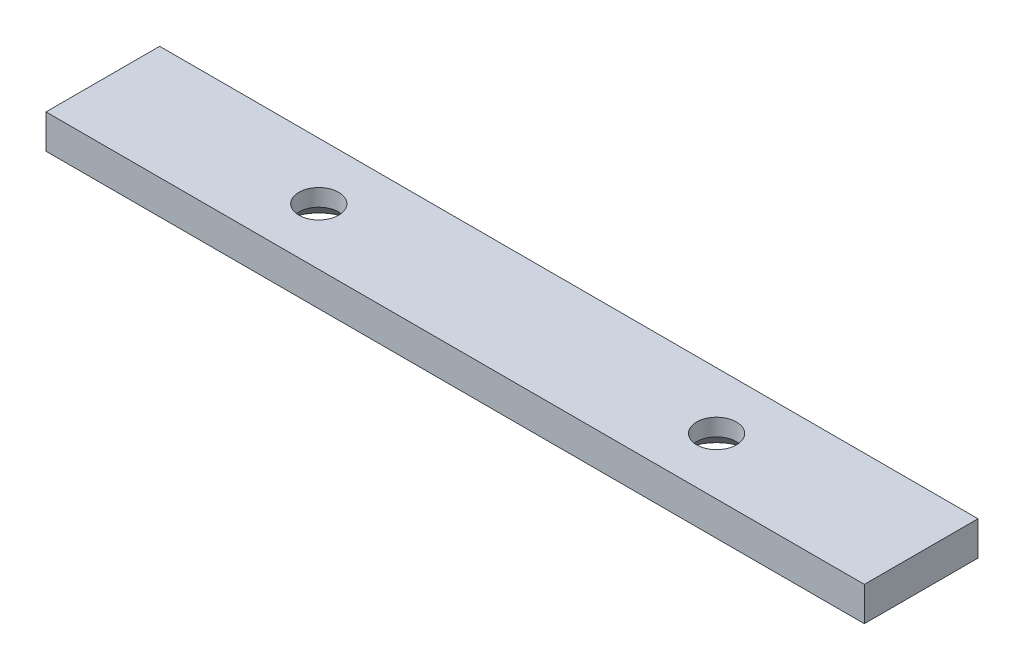
ISO-10303-21;
HEADER;
FILE_DESCRIPTION(('STEP AP214'),'2;1');
FILE_NAME('part.step','',(''),(''),'','','');
FILE_SCHEMA(('AUTOMOTIVE_DESIGN { 1 0 10303 214 1 1 1 1 }'));
ENDSEC;
DATA;
#1=APPLICATION_CONTEXT('core data for automotive mechanical design processes');
#2=APPLICATION_PROTOCOL_DEFINITION('international standard','automotive_design',2000,#1);
#3=PRODUCT_CONTEXT('',#1,'mechanical');
#4=PRODUCT('Part','Part','',(#3));
#5=PRODUCT_RELATED_PRODUCT_CATEGORY('part','',(#4));
#6=PRODUCT_DEFINITION_FORMATION('','',#4);
#7=PRODUCT_DEFINITION_CONTEXT('part definition',#1,'design');
#8=PRODUCT_DEFINITION('design','',#6,#7);
#9=PRODUCT_DEFINITION_SHAPE('','',#8);
#10=(LENGTH_UNIT() NAMED_UNIT(*) SI_UNIT(.MILLI.,.METRE.));
#11=(NAMED_UNIT(*) PLANE_ANGLE_UNIT() SI_UNIT($,.RADIAN.));
#12=(NAMED_UNIT(*) SI_UNIT($,.STERADIAN.) SOLID_ANGLE_UNIT());
#13=UNCERTAINTY_MEASURE_WITH_UNIT(LENGTH_MEASURE(1.E-05),#10,'distance_accuracy_value','');
#14=(GEOMETRIC_REPRESENTATION_CONTEXT(3) GLOBAL_UNCERTAINTY_ASSIGNED_CONTEXT((#13)) GLOBAL_UNIT_ASSIGNED_CONTEXT((#10,
#11,#12)) REPRESENTATION_CONTEXT('',''));
#15=CARTESIAN_POINT('',(0.,0.,0.));
#16=DIRECTION('',(0.,0.,1.));
#17=DIRECTION('',(1.,0.,0.));
#18=AXIS2_PLACEMENT_3D('',#15,#16,#17);
#19=CARTESIAN_POINT('',(0.,3.,10.));
#20=DIRECTION('',(0.,0.,-1.));
#21=DIRECTION('',(-1.,0.,0.));
#22=AXIS2_PLACEMENT_3D('',#19,#20,#21);
#23=PLANE('',#22);
#24=DIRECTION('',(1.,0.,0.));
#25=VECTOR('',#24,1.);
#26=CARTESIAN_POINT('',(0.,-3.,10.));
#27=LINE('',#26,#25);
#28=CARTESIAN_POINT('',(-72.,-3.,10.));
#29=VERTEX_POINT('',#28);
#30=CARTESIAN_POINT('',(72.,-3.,10.));
#31=VERTEX_POINT('',#30);
#32=EDGE_CURVE('E111',#29,#31,#27,.T.);
#33=ORIENTED_EDGE('',*,*,#32,.T.);
#34=DIRECTION('',(0.,-1.,0.));
#35=VECTOR('',#34,1.);
#36=CARTESIAN_POINT('',(72.,3.,10.));
#37=LINE('',#36,#35);
#38=CARTESIAN_POINT('',(72.,3.,10.));
#39=VERTEX_POINT('',#38);
#40=EDGE_CURVE('E11',#39,#31,#37,.T.);
#41=ORIENTED_EDGE('',*,*,#40,.F.);
#42=DIRECTION('',(1.,0.,0.));
#43=VECTOR('',#42,1.);
#44=CARTESIAN_POINT('',(0.,3.,10.));
#45=LINE('',#44,#43);
#46=CARTESIAN_POINT('',(-72.,3.,10.));
#47=VERTEX_POINT('',#46);
#48=EDGE_CURVE('E92',#47,#39,#45,.T.);
#49=ORIENTED_EDGE('',*,*,#48,.F.);
#50=DIRECTION('',(0.,-1.,0.));
#51=VECTOR('',#50,1.);
#52=CARTESIAN_POINT('',(-72.,3.,10.));
#53=LINE('',#52,#51);
#54=EDGE_CURVE('E59',#47,#29,#53,.T.);
#55=ORIENTED_EDGE('',*,*,#54,.T.);
#56=EDGE_LOOP('',(#33,#41,#49,#55));
#57=FACE_BOUND('',#56,.T.);
#58=ADVANCED_FACE('F42',(#57),#23,.F.);
#59=CARTESIAN_POINT('',(72.,3.,0.));
#60=DIRECTION('',(-1.,0.,0.));
#61=DIRECTION('',(0.,0.,1.));
#62=AXIS2_PLACEMENT_3D('',#59,#60,#61);
#63=PLANE('',#62);
#64=DIRECTION('',(0.,0.,-1.));
#65=VECTOR('',#64,1.);
#66=CARTESIAN_POINT('',(72.,-3.,0.));
#67=LINE('',#66,#65);
#68=CARTESIAN_POINT('',(72.,-3.,-10.));
#69=VERTEX_POINT('',#68);
#70=EDGE_CURVE('E98',#31,#69,#67,.T.);
#71=ORIENTED_EDGE('',*,*,#70,.T.);
#72=DIRECTION('',(0.,-1.,0.));
#73=VECTOR('',#72,1.);
#74=CARTESIAN_POINT('',(72.,3.,-10.));
#75=LINE('',#74,#73);
#76=CARTESIAN_POINT('',(72.,3.,-10.));
#77=VERTEX_POINT('',#76);
#78=EDGE_CURVE('E51',#77,#69,#75,.T.);
#79=ORIENTED_EDGE('',*,*,#78,.F.);
#80=DIRECTION('',(0.,0.,-1.));
#81=VECTOR('',#80,1.);
#82=CARTESIAN_POINT('',(72.,3.,0.));
#83=LINE('',#82,#81);
#84=EDGE_CURVE('E84',#39,#77,#83,.T.);
#85=ORIENTED_EDGE('',*,*,#84,.F.);
#86=ORIENTED_EDGE('',*,*,#40,.T.);
#87=EDGE_LOOP('',(#71,#79,#85,#86));
#88=FACE_BOUND('',#87,.T.);
#89=ADVANCED_FACE('F97',(#88),#63,.F.);
#90=CARTESIAN_POINT('',(0.,3.,-10.));
#91=DIRECTION('',(0.,0.,-1.));
#92=DIRECTION('',(-1.,0.,0.));
#93=AXIS2_PLACEMENT_3D('',#90,#91,#92);
#94=PLANE('',#93);
#95=DIRECTION('',(1.,0.,0.));
#96=VECTOR('',#95,1.);
#97=CARTESIAN_POINT('',(0.,-3.,-10.));
#98=LINE('',#97,#96);
#99=CARTESIAN_POINT('',(-72.,-3.,-10.));
#100=VERTEX_POINT('',#99);
#101=EDGE_CURVE('E117',#100,#69,#98,.T.);
#102=ORIENTED_EDGE('',*,*,#101,.F.);
#103=DIRECTION('',(0.,-1.,0.));
#104=VECTOR('',#103,1.);
#105=CARTESIAN_POINT('',(-72.,3.,-10.));
#106=LINE('',#105,#104);
#107=CARTESIAN_POINT('',(-72.,3.,-10.));
#108=VERTEX_POINT('',#107);
#109=EDGE_CURVE('E73',#108,#100,#106,.T.);
#110=ORIENTED_EDGE('',*,*,#109,.F.);
#111=DIRECTION('',(1.,0.,0.));
#112=VECTOR('',#111,1.);
#113=CARTESIAN_POINT('',(0.,3.,-10.));
#114=LINE('',#113,#112);
#115=EDGE_CURVE('E91',#108,#77,#114,.T.);
#116=ORIENTED_EDGE('',*,*,#115,.T.);
#117=ORIENTED_EDGE('',*,*,#78,.T.);
#118=EDGE_LOOP('',(#102,#110,#116,#117));
#119=FACE_BOUND('',#118,.T.);
#120=ADVANCED_FACE('F102',(#119),#94,.T.);
#121=CARTESIAN_POINT('',(-72.,3.,0.));
#122=DIRECTION('',(-1.,0.,0.));
#123=DIRECTION('',(0.,0.,1.));
#124=AXIS2_PLACEMENT_3D('',#121,#122,#123);
#125=PLANE('',#124);
#126=DIRECTION('',(0.,0.,-1.));
#127=VECTOR('',#126,1.);
#128=CARTESIAN_POINT('',(-72.,-3.,0.));
#129=LINE('',#128,#127);
#130=EDGE_CURVE('E120',#29,#100,#129,.T.);
#131=ORIENTED_EDGE('',*,*,#130,.F.);
#132=ORIENTED_EDGE('',*,*,#54,.F.);
#133=DIRECTION('',(0.,0.,-1.));
#134=VECTOR('',#133,1.);
#135=CARTESIAN_POINT('',(-72.,3.,0.));
#136=LINE('',#135,#134);
#137=EDGE_CURVE('E104',#47,#108,#136,.T.);
#138=ORIENTED_EDGE('',*,*,#137,.T.);
#139=ORIENTED_EDGE('',*,*,#109,.T.);
#140=EDGE_LOOP('',(#131,#132,#138,#139));
#141=FACE_BOUND('',#140,.T.);
#142=ADVANCED_FACE('F191',(#141),#125,.T.);
#143=CARTESIAN_POINT('',(0.,3.,0.));
#144=DIRECTION('',(0.,1.,0.));
#145=DIRECTION('',(0.,0.,1.));
#146=AXIS2_PLACEMENT_3D('',#143,#144,#145);
#147=PLANE('',#146);
#148=CARTESIAN_POINT('',(36.,3.,0.));
#149=DIRECTION('',(0.,-1.,0.));
#150=DIRECTION('',(0.,0.,-1.));
#151=AXIS2_PLACEMENT_3D('',#148,#149,#150);
#152=CIRCLE('',#151,3.5);
#153=CARTESIAN_POINT('',(36.,3.,-3.5));
#154=VERTEX_POINT('',#153);
#155=EDGE_CURVE('E141',#154,#154,#152,.T.);
#156=ORIENTED_EDGE('',*,*,#155,.T.);
#157=EDGE_LOOP('',(#156));
#158=FACE_BOUND('',#157,.T.);
#159=CARTESIAN_POINT('',(-34.,3.,0.));
#160=DIRECTION('',(0.,-1.,0.));
#161=DIRECTION('',(0.,0.,-1.));
#162=AXIS2_PLACEMENT_3D('',#159,#160,#161);
#163=CIRCLE('',#162,3.5);
#164=CARTESIAN_POINT('',(-34.,3.,-3.5));
#165=VERTEX_POINT('',#164);
#166=EDGE_CURVE('E145',#165,#165,#163,.T.);
#167=ORIENTED_EDGE('',*,*,#166,.T.);
#168=EDGE_LOOP('',(#167));
#169=FACE_BOUND('',#168,.T.);
#170=ORIENTED_EDGE('',*,*,#48,.T.);
#171=ORIENTED_EDGE('',*,*,#84,.T.);
#172=ORIENTED_EDGE('',*,*,#115,.F.);
#173=ORIENTED_EDGE('',*,*,#137,.F.);
#174=EDGE_LOOP('',(#170,#171,#172,#173));
#175=FACE_BOUND('',#174,.T.);
#176=ADVANCED_FACE('F88',(#158,#169,#175),#147,.T.);
#177=CARTESIAN_POINT('',(0.,-3.,0.));
#178=DIRECTION('',(0.,1.,0.));
#179=DIRECTION('',(0.,0.,1.));
#180=AXIS2_PLACEMENT_3D('',#177,#178,#179);
#181=PLANE('',#180);
#182=CARTESIAN_POINT('',(-34.,-3.,0.));
#183=DIRECTION('',(0.,1.,0.));
#184=DIRECTION('',(0.,0.,1.));
#185=AXIS2_PLACEMENT_3D('',#182,#183,#184);
#186=CIRCLE('',#185,6.50000000000001);
#187=CARTESIAN_POINT('',(-34.,-3.,6.50000000000001));
#188=VERTEX_POINT('',#187);
#189=EDGE_CURVE('E114',#188,#188,#186,.T.);
#190=ORIENTED_EDGE('',*,*,#189,.T.);
#191=EDGE_LOOP('',(#190));
#192=FACE_BOUND('',#191,.T.);
#193=CARTESIAN_POINT('',(36.,-3.,0.));
#194=DIRECTION('',(0.,1.,0.));
#195=DIRECTION('',(0.,0.,1.));
#196=AXIS2_PLACEMENT_3D('',#193,#194,#195);
#197=CIRCLE('',#196,6.50000000000001);
#198=CARTESIAN_POINT('',(36.,-3.,6.50000000000001));
#199=VERTEX_POINT('',#198);
#200=EDGE_CURVE('E137',#199,#199,#197,.T.);
#201=ORIENTED_EDGE('',*,*,#200,.T.);
#202=EDGE_LOOP('',(#201));
#203=FACE_BOUND('',#202,.T.);
#204=ORIENTED_EDGE('',*,*,#32,.F.);
#205=ORIENTED_EDGE('',*,*,#130,.T.);
#206=ORIENTED_EDGE('',*,*,#101,.T.);
#207=ORIENTED_EDGE('',*,*,#70,.F.);
#208=EDGE_LOOP('',(#204,#205,#206,#207));
#209=FACE_BOUND('',#208,.T.);
#210=ADVANCED_FACE('F174',(#192,#203,#209),#181,.F.);
#211=CARTESIAN_POINT('',(36.,0.,0.));
#212=DIRECTION('',(0.,-1.,0.));
#213=DIRECTION('',(0.,0.,1.));
#214=AXIS2_PLACEMENT_3D('',#211,#212,#213);
#215=CONICAL_SURFACE('',#214,3.5,0.78539816339745);
#216=ORIENTED_EDGE('',*,*,#200,.F.);
#217=EDGE_LOOP('',(#216));
#218=FACE_BOUND('',#217,.T.);
#219=CARTESIAN_POINT('',(36.,0.,0.));
#220=DIRECTION('',(0.,-1.,0.));
#221=DIRECTION('',(0.,0.,-1.));
#222=AXIS2_PLACEMENT_3D('',#219,#220,#221);
#223=CIRCLE('',#222,3.5);
#224=CARTESIAN_POINT('',(36.,0.,-3.5));
#225=VERTEX_POINT('',#224);
#226=EDGE_CURVE('E153',#225,#225,#223,.T.);
#227=ORIENTED_EDGE('',*,*,#226,.F.);
#228=EDGE_LOOP('',(#227));
#229=FACE_BOUND('',#228,.T.);
#230=ADVANCED_FACE('F171',(#218,#229),#215,.F.);
#231=CARTESIAN_POINT('',(-34.,0.,0.));
#232=DIRECTION('',(0.,-1.,0.));
#233=DIRECTION('',(0.,0.,1.));
#234=AXIS2_PLACEMENT_3D('',#231,#232,#233);
#235=CONICAL_SURFACE('',#234,3.5,0.78539816339745);
#236=ORIENTED_EDGE('',*,*,#189,.F.);
#237=EDGE_LOOP('',(#236));
#238=FACE_BOUND('',#237,.T.);
#239=CARTESIAN_POINT('',(-34.,0.,0.));
#240=DIRECTION('',(0.,-1.,0.));
#241=DIRECTION('',(0.,0.,-1.));
#242=AXIS2_PLACEMENT_3D('',#239,#240,#241);
#243=CIRCLE('',#242,3.5);
#244=CARTESIAN_POINT('',(-34.,0.,-3.5));
#245=VERTEX_POINT('',#244);
#246=EDGE_CURVE('E149',#245,#245,#243,.T.);
#247=ORIENTED_EDGE('',*,*,#246,.F.);
#248=EDGE_LOOP('',(#247));
#249=FACE_BOUND('',#248,.T.);
#250=ADVANCED_FACE('F173',(#238,#249),#235,.F.);
#251=CARTESIAN_POINT('',(-34.,3.,0.));
#252=DIRECTION('',(0.,-1.,0.));
#253=DIRECTION('',(0.,0.,-1.));
#254=AXIS2_PLACEMENT_3D('',#251,#252,#253);
#255=CYLINDRICAL_SURFACE('',#254,3.5);
#256=ORIENTED_EDGE('',*,*,#166,.F.);
#257=EDGE_LOOP('',(#256));
#258=FACE_BOUND('',#257,.T.);
#259=ORIENTED_EDGE('',*,*,#246,.T.);
#260=EDGE_LOOP('',(#259));
#261=FACE_BOUND('',#260,.T.);
#262=ADVANCED_FACE('F167',(#258,#261),#255,.F.);
#263=CARTESIAN_POINT('',(36.,3.,0.));
#264=DIRECTION('',(0.,-1.,0.));
#265=DIRECTION('',(0.,0.,-1.));
#266=AXIS2_PLACEMENT_3D('',#263,#264,#265);
#267=CYLINDRICAL_SURFACE('',#266,3.5);
#268=ORIENTED_EDGE('',*,*,#155,.F.);
#269=EDGE_LOOP('',(#268));
#270=FACE_BOUND('',#269,.T.);
#271=ORIENTED_EDGE('',*,*,#226,.T.);
#272=EDGE_LOOP('',(#271));
#273=FACE_BOUND('',#272,.T.);
#274=ADVANCED_FACE('F164',(#270,#273),#267,.F.);
#275=CLOSED_SHELL('',(#58,#89,#120,#142,#176,#210,#230,#250,#262,#274));
#276=MANIFOLD_SOLID_BREP('B2',#275);
#277=ADVANCED_BREP_SHAPE_REPRESENTATION('',(#18,#276),#14);
#278=SHAPE_DEFINITION_REPRESENTATION(#9,#277);
ENDSEC;
END-ISO-10303-21;
